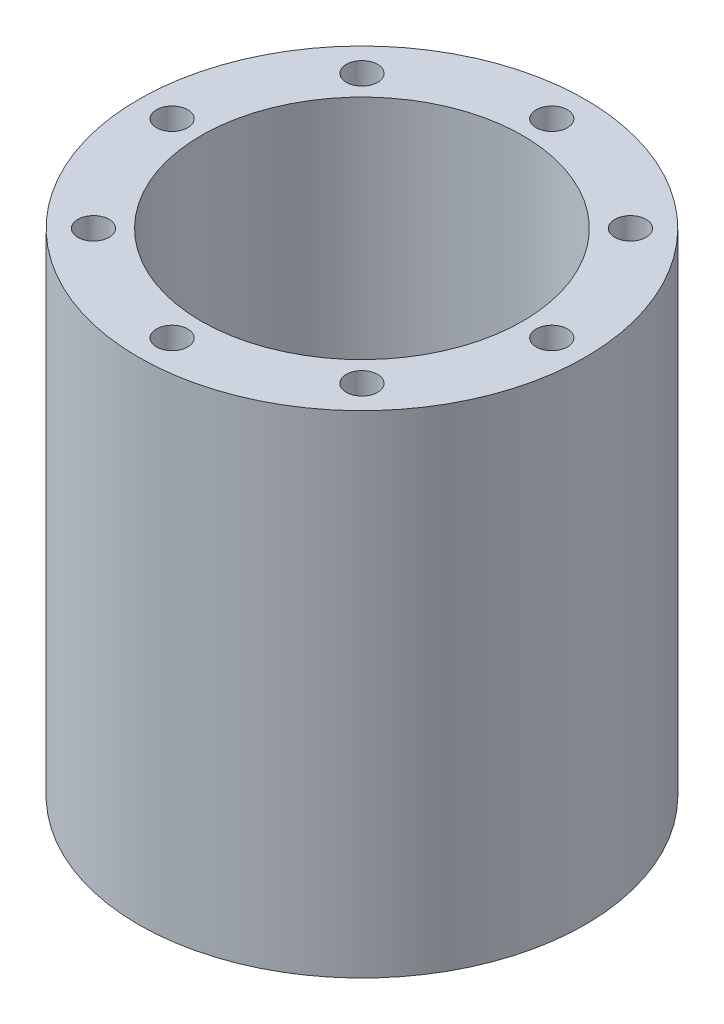
ISO-10303-21;
HEADER;
FILE_DESCRIPTION(('STEP AP214'),'2;1');
FILE_NAME('part.step','',(''),(''),'','','');
FILE_SCHEMA(('AUTOMOTIVE_DESIGN { 1 0 10303 214 1 1 1 1 }'));
ENDSEC;
DATA;
#1=APPLICATION_CONTEXT('core data for automotive mechanical design processes');
#2=APPLICATION_PROTOCOL_DEFINITION('international standard','automotive_design',2000,#1);
#3=PRODUCT_CONTEXT('',#1,'mechanical');
#4=PRODUCT('Part','Part','',(#3));
#5=PRODUCT_RELATED_PRODUCT_CATEGORY('part','',(#4));
#6=PRODUCT_DEFINITION_FORMATION('','',#4);
#7=PRODUCT_DEFINITION_CONTEXT('part definition',#1,'design');
#8=PRODUCT_DEFINITION('design','',#6,#7);
#9=PRODUCT_DEFINITION_SHAPE('','',#8);
#10=(LENGTH_UNIT() NAMED_UNIT(*) SI_UNIT(.MILLI.,.METRE.));
#11=(NAMED_UNIT(*) PLANE_ANGLE_UNIT() SI_UNIT($,.RADIAN.));
#12=(NAMED_UNIT(*) SI_UNIT($,.STERADIAN.) SOLID_ANGLE_UNIT());
#13=UNCERTAINTY_MEASURE_WITH_UNIT(LENGTH_MEASURE(1.E-05),#10,'distance_accuracy_value','');
#14=(GEOMETRIC_REPRESENTATION_CONTEXT(3) GLOBAL_UNCERTAINTY_ASSIGNED_CONTEXT((#13)) GLOBAL_UNIT_ASSIGNED_CONTEXT((#10,
#11,#12)) REPRESENTATION_CONTEXT('',''));
#15=CARTESIAN_POINT('',(0.,0.,0.));
#16=DIRECTION('',(0.,0.,1.));
#17=DIRECTION('',(1.,0.,0.));
#18=AXIS2_PLACEMENT_3D('',#15,#16,#17);
#19=CARTESIAN_POINT('',(-15.0260191002141,27.5,-15.0260191002141));
#20=DIRECTION('',(0.,-1.,0.));
#21=DIRECTION('',(0.,0.,-1.));
#22=AXIS2_PLACEMENT_3D('',#19,#20,#21);
#23=CYLINDRICAL_SURFACE('',#22,1.75);
#24=CARTESIAN_POINT('',(-15.0260191002141,27.5,-15.0260191002141));
#25=DIRECTION('',(0.,1.,0.));
#26=DIRECTION('',(0.,0.,1.));
#27=AXIS2_PLACEMENT_3D('',#24,#25,#26);
#28=CIRCLE('',#27,1.75);
#29=CARTESIAN_POINT('',(-15.0260191002141,27.5,-13.2760191002141));
#30=VERTEX_POINT('',#29);
#31=EDGE_CURVE('E43',#30,#30,#28,.T.);
#32=ORIENTED_EDGE('',*,*,#31,.T.);
#33=EDGE_LOOP('',(#32));
#34=FACE_BOUND('',#33,.T.);
#35=CARTESIAN_POINT('',(-15.0260191002141,-27.5,-15.0260191002141));
#36=DIRECTION('',(0.,1.,0.));
#37=DIRECTION('',(0.,0.,1.));
#38=AXIS2_PLACEMENT_3D('',#35,#36,#37);
#39=CIRCLE('',#38,1.75);
#40=CARTESIAN_POINT('',(-15.0260191002141,-27.5,-13.2760191002141));
#41=VERTEX_POINT('',#40);
#42=EDGE_CURVE('E75',#41,#41,#39,.T.);
#43=ORIENTED_EDGE('',*,*,#42,.F.);
#44=EDGE_LOOP('',(#43));
#45=FACE_BOUND('',#44,.T.);
#46=ADVANCED_FACE('F35',(#34,#45),#23,.F.);
#47=CARTESIAN_POINT('',(-21.25,27.5,0.));
#48=DIRECTION('',(0.,-1.,0.));
#49=DIRECTION('',(0.,0.,-1.));
#50=AXIS2_PLACEMENT_3D('',#47,#48,#49);
#51=CYLINDRICAL_SURFACE('',#50,1.75);
#52=CARTESIAN_POINT('',(-21.25,27.5,0.));
#53=DIRECTION('',(0.,1.,0.));
#54=DIRECTION('',(0.,0.,1.));
#55=AXIS2_PLACEMENT_3D('',#52,#53,#54);
#56=CIRCLE('',#55,1.75);
#57=CARTESIAN_POINT('',(-21.25,27.5,1.75));
#58=VERTEX_POINT('',#57);
#59=EDGE_CURVE('E48',#58,#58,#56,.T.);
#60=ORIENTED_EDGE('',*,*,#59,.T.);
#61=EDGE_LOOP('',(#60));
#62=FACE_BOUND('',#61,.T.);
#63=CARTESIAN_POINT('',(-21.25,-27.5,0.));
#64=DIRECTION('',(0.,1.,0.));
#65=DIRECTION('',(0.,0.,1.));
#66=AXIS2_PLACEMENT_3D('',#63,#64,#65);
#67=CIRCLE('',#66,1.75);
#68=CARTESIAN_POINT('',(-21.25,-27.5,1.75));
#69=VERTEX_POINT('',#68);
#70=EDGE_CURVE('E73',#69,#69,#67,.T.);
#71=ORIENTED_EDGE('',*,*,#70,.F.);
#72=EDGE_LOOP('',(#71));
#73=FACE_BOUND('',#72,.T.);
#74=ADVANCED_FACE('F108',(#62,#73),#51,.F.);
#75=CARTESIAN_POINT('',(-15.0260191002141,27.5,15.0260191002141));
#76=DIRECTION('',(0.,-1.,0.));
#77=DIRECTION('',(0.,0.,-1.));
#78=AXIS2_PLACEMENT_3D('',#75,#76,#77);
#79=CYLINDRICAL_SURFACE('',#78,1.75);
#80=CARTESIAN_POINT('',(-15.0260191002141,27.5,15.0260191002141));
#81=DIRECTION('',(0.,1.,0.));
#82=DIRECTION('',(0.,0.,1.));
#83=AXIS2_PLACEMENT_3D('',#80,#81,#82);
#84=CIRCLE('',#83,1.75);
#85=CARTESIAN_POINT('',(-15.0260191002141,27.5,16.7760191002141));
#86=VERTEX_POINT('',#85);
#87=EDGE_CURVE('E103',#86,#86,#84,.T.);
#88=ORIENTED_EDGE('',*,*,#87,.T.);
#89=EDGE_LOOP('',(#88));
#90=FACE_BOUND('',#89,.T.);
#91=CARTESIAN_POINT('',(-15.0260191002141,-27.5,15.0260191002141));
#92=DIRECTION('',(0.,1.,0.));
#93=DIRECTION('',(0.,0.,1.));
#94=AXIS2_PLACEMENT_3D('',#91,#92,#93);
#95=CIRCLE('',#94,1.75);
#96=CARTESIAN_POINT('',(-15.0260191002141,-27.5,16.7760191002141));
#97=VERTEX_POINT('',#96);
#98=EDGE_CURVE('E70',#97,#97,#95,.T.);
#99=ORIENTED_EDGE('',*,*,#98,.F.);
#100=EDGE_LOOP('',(#99));
#101=FACE_BOUND('',#100,.T.);
#102=ADVANCED_FACE('F126',(#90,#101),#79,.F.);
#103=CARTESIAN_POINT('',(0.,27.5,21.25));
#104=DIRECTION('',(0.,-1.,0.));
#105=DIRECTION('',(0.,0.,-1.));
#106=AXIS2_PLACEMENT_3D('',#103,#104,#105);
#107=CYLINDRICAL_SURFACE('',#106,1.75);
#108=CARTESIAN_POINT('',(0.,27.5,21.25));
#109=DIRECTION('',(0.,1.,0.));
#110=DIRECTION('',(0.,0.,1.));
#111=AXIS2_PLACEMENT_3D('',#108,#109,#110);
#112=CIRCLE('',#111,1.75);
#113=CARTESIAN_POINT('',(0.,27.5,23.));
#114=VERTEX_POINT('',#113);
#115=EDGE_CURVE('E100',#114,#114,#112,.T.);
#116=ORIENTED_EDGE('',*,*,#115,.T.);
#117=EDGE_LOOP('',(#116));
#118=FACE_BOUND('',#117,.T.);
#119=CARTESIAN_POINT('',(0.,-27.5,21.25));
#120=DIRECTION('',(0.,1.,0.));
#121=DIRECTION('',(0.,0.,1.));
#122=AXIS2_PLACEMENT_3D('',#119,#120,#121);
#123=CIRCLE('',#122,1.75);
#124=CARTESIAN_POINT('',(0.,-27.5,23.));
#125=VERTEX_POINT('',#124);
#126=EDGE_CURVE('E67',#125,#125,#123,.T.);
#127=ORIENTED_EDGE('',*,*,#126,.F.);
#128=EDGE_LOOP('',(#127));
#129=FACE_BOUND('',#128,.T.);
#130=ADVANCED_FACE('F133',(#118,#129),#107,.F.);
#131=CARTESIAN_POINT('',(15.0260191002141,27.5,15.0260191002141));
#132=DIRECTION('',(0.,-1.,0.));
#133=DIRECTION('',(0.,0.,-1.));
#134=AXIS2_PLACEMENT_3D('',#131,#132,#133);
#135=CYLINDRICAL_SURFACE('',#134,1.75);
#136=CARTESIAN_POINT('',(15.0260191002141,27.5,15.0260191002141));
#137=DIRECTION('',(0.,1.,0.));
#138=DIRECTION('',(0.,0.,1.));
#139=AXIS2_PLACEMENT_3D('',#136,#137,#138);
#140=CIRCLE('',#139,1.75);
#141=CARTESIAN_POINT('',(15.0260191002141,27.5,16.7760191002141));
#142=VERTEX_POINT('',#141);
#143=EDGE_CURVE('E97',#142,#142,#140,.T.);
#144=ORIENTED_EDGE('',*,*,#143,.T.);
#145=EDGE_LOOP('',(#144));
#146=FACE_BOUND('',#145,.T.);
#147=CARTESIAN_POINT('',(15.0260191002141,-27.5,15.0260191002141));
#148=DIRECTION('',(0.,1.,0.));
#149=DIRECTION('',(0.,0.,1.));
#150=AXIS2_PLACEMENT_3D('',#147,#148,#149);
#151=CIRCLE('',#150,1.75);
#152=CARTESIAN_POINT('',(15.0260191002141,-27.5,16.7760191002141));
#153=VERTEX_POINT('',#152);
#154=EDGE_CURVE('E64',#153,#153,#151,.T.);
#155=ORIENTED_EDGE('',*,*,#154,.F.);
#156=EDGE_LOOP('',(#155));
#157=FACE_BOUND('',#156,.T.);
#158=ADVANCED_FACE('F137',(#146,#157),#135,.F.);
#159=CARTESIAN_POINT('',(21.25,27.5,0.));
#160=DIRECTION('',(0.,-1.,0.));
#161=DIRECTION('',(0.,0.,-1.));
#162=AXIS2_PLACEMENT_3D('',#159,#160,#161);
#163=CYLINDRICAL_SURFACE('',#162,1.75);
#164=CARTESIAN_POINT('',(21.25,27.5,0.));
#165=DIRECTION('',(0.,1.,0.));
#166=DIRECTION('',(0.,0.,1.));
#167=AXIS2_PLACEMENT_3D('',#164,#165,#166);
#168=CIRCLE('',#167,1.75);
#169=CARTESIAN_POINT('',(21.25,27.5,1.75));
#170=VERTEX_POINT('',#169);
#171=EDGE_CURVE('E94',#170,#170,#168,.T.);
#172=ORIENTED_EDGE('',*,*,#171,.T.);
#173=EDGE_LOOP('',(#172));
#174=FACE_BOUND('',#173,.T.);
#175=CARTESIAN_POINT('',(21.25,-27.5,0.));
#176=DIRECTION('',(0.,1.,0.));
#177=DIRECTION('',(0.,0.,1.));
#178=AXIS2_PLACEMENT_3D('',#175,#176,#177);
#179=CIRCLE('',#178,1.75);
#180=CARTESIAN_POINT('',(21.25,-27.5,1.75));
#181=VERTEX_POINT('',#180);
#182=EDGE_CURVE('E61',#181,#181,#179,.T.);
#183=ORIENTED_EDGE('',*,*,#182,.F.);
#184=EDGE_LOOP('',(#183));
#185=FACE_BOUND('',#184,.T.);
#186=ADVANCED_FACE('F141',(#174,#185),#163,.F.);
#187=CARTESIAN_POINT('',(15.0260191002141,27.5,-15.0260191002141));
#188=DIRECTION('',(0.,-1.,0.));
#189=DIRECTION('',(0.,0.,-1.));
#190=AXIS2_PLACEMENT_3D('',#187,#188,#189);
#191=CYLINDRICAL_SURFACE('',#190,1.75);
#192=CARTESIAN_POINT('',(15.0260191002141,27.5,-15.0260191002141));
#193=DIRECTION('',(0.,1.,0.));
#194=DIRECTION('',(0.,0.,1.));
#195=AXIS2_PLACEMENT_3D('',#192,#193,#194);
#196=CIRCLE('',#195,1.75);
#197=CARTESIAN_POINT('',(15.0260191002141,27.5,-13.2760191002141));
#198=VERTEX_POINT('',#197);
#199=EDGE_CURVE('E89',#198,#198,#196,.T.);
#200=ORIENTED_EDGE('',*,*,#199,.T.);
#201=EDGE_LOOP('',(#200));
#202=FACE_BOUND('',#201,.T.);
#203=CARTESIAN_POINT('',(15.0260191002141,-27.5,-15.0260191002141));
#204=DIRECTION('',(0.,1.,0.));
#205=DIRECTION('',(0.,0.,1.));
#206=AXIS2_PLACEMENT_3D('',#203,#204,#205);
#207=CIRCLE('',#206,1.75);
#208=CARTESIAN_POINT('',(15.0260191002141,-27.5,-13.2760191002141));
#209=VERTEX_POINT('',#208);
#210=EDGE_CURVE('E58',#209,#209,#207,.T.);
#211=ORIENTED_EDGE('',*,*,#210,.F.);
#212=EDGE_LOOP('',(#211));
#213=FACE_BOUND('',#212,.T.);
#214=ADVANCED_FACE('F145',(#202,#213),#191,.F.);
#215=CARTESIAN_POINT('',(0.,27.5,-21.25));
#216=DIRECTION('',(0.,-1.,0.));
#217=DIRECTION('',(0.,0.,-1.));
#218=AXIS2_PLACEMENT_3D('',#215,#216,#217);
#219=CYLINDRICAL_SURFACE('',#218,1.75);
#220=CARTESIAN_POINT('',(0.,27.5,-21.25));
#221=DIRECTION('',(0.,1.,0.));
#222=DIRECTION('',(0.,0.,1.));
#223=AXIS2_PLACEMENT_3D('',#220,#221,#222);
#224=CIRCLE('',#223,1.75);
#225=CARTESIAN_POINT('',(0.,27.5,-19.5));
#226=VERTEX_POINT('',#225);
#227=EDGE_CURVE('E84',#226,#226,#224,.T.);
#228=ORIENTED_EDGE('',*,*,#227,.T.);
#229=EDGE_LOOP('',(#228));
#230=FACE_BOUND('',#229,.T.);
#231=CARTESIAN_POINT('',(0.,-27.5,-21.25));
#232=DIRECTION('',(0.,1.,0.));
#233=DIRECTION('',(0.,0.,1.));
#234=AXIS2_PLACEMENT_3D('',#231,#232,#233);
#235=CIRCLE('',#234,1.75);
#236=CARTESIAN_POINT('',(0.,-27.5,-19.5));
#237=VERTEX_POINT('',#236);
#238=EDGE_CURVE('E55',#237,#237,#235,.T.);
#239=ORIENTED_EDGE('',*,*,#238,.F.);
#240=EDGE_LOOP('',(#239));
#241=FACE_BOUND('',#240,.T.);
#242=ADVANCED_FACE('F148',(#230,#241),#219,.F.);
#243=CARTESIAN_POINT('',(0.,27.5,0.));
#244=DIRECTION('',(0.,-1.,0.));
#245=DIRECTION('',(0.,0.,-1.));
#246=AXIS2_PLACEMENT_3D('',#243,#244,#245);
#247=CYLINDRICAL_SURFACE('',#246,18.);
#248=CARTESIAN_POINT('',(0.,27.5,0.));
#249=DIRECTION('',(0.,1.,0.));
#250=DIRECTION('',(0.,0.,1.));
#251=AXIS2_PLACEMENT_3D('',#248,#249,#250);
#252=CIRCLE('',#251,18.);
#253=CARTESIAN_POINT('',(0.,27.5,18.));
#254=VERTEX_POINT('',#253);
#255=EDGE_CURVE('E80',#254,#254,#252,.T.);
#256=ORIENTED_EDGE('',*,*,#255,.T.);
#257=EDGE_LOOP('',(#256));
#258=FACE_BOUND('',#257,.T.);
#259=CARTESIAN_POINT('',(0.,-27.5,0.));
#260=DIRECTION('',(0.,1.,0.));
#261=DIRECTION('',(0.,0.,1.));
#262=AXIS2_PLACEMENT_3D('',#259,#260,#261);
#263=CIRCLE('',#262,18.);
#264=CARTESIAN_POINT('',(0.,-27.5,18.));
#265=VERTEX_POINT('',#264);
#266=EDGE_CURVE('E52',#265,#265,#263,.T.);
#267=ORIENTED_EDGE('',*,*,#266,.F.);
#268=EDGE_LOOP('',(#267));
#269=FACE_BOUND('',#268,.T.);
#270=ADVANCED_FACE('F37',(#258,#269),#247,.F.);
#271=CARTESIAN_POINT('',(0.,27.5,0.));
#272=DIRECTION('',(0.,-1.,0.));
#273=DIRECTION('',(0.,0.,-1.));
#274=AXIS2_PLACEMENT_3D('',#271,#272,#273);
#275=CYLINDRICAL_SURFACE('',#274,25.);
#276=CARTESIAN_POINT('',(0.,27.5,0.));
#277=DIRECTION('',(0.,1.,0.));
#278=DIRECTION('',(0.,0.,1.));
#279=AXIS2_PLACEMENT_3D('',#276,#277,#278);
#280=CIRCLE('',#279,25.);
#281=CARTESIAN_POINT('',(0.,27.5,25.));
#282=VERTEX_POINT('',#281);
#283=EDGE_CURVE('E10',#282,#282,#280,.T.);
#284=ORIENTED_EDGE('',*,*,#283,.F.);
#285=EDGE_LOOP('',(#284));
#286=FACE_BOUND('',#285,.T.);
#287=CARTESIAN_POINT('',(0.,-27.5,0.));
#288=DIRECTION('',(0.,1.,0.));
#289=DIRECTION('',(0.,0.,1.));
#290=AXIS2_PLACEMENT_3D('',#287,#288,#289);
#291=CIRCLE('',#290,25.);
#292=CARTESIAN_POINT('',(0.,-27.5,25.));
#293=VERTEX_POINT('',#292);
#294=EDGE_CURVE('E39',#293,#293,#291,.T.);
#295=ORIENTED_EDGE('',*,*,#294,.T.);
#296=EDGE_LOOP('',(#295));
#297=FACE_BOUND('',#296,.T.);
#298=ADVANCED_FACE('F115',(#286,#297),#275,.T.);
#299=CARTESIAN_POINT('',(0.,27.5,0.));
#300=DIRECTION('',(0.,1.,0.));
#301=DIRECTION('',(0.,0.,1.));
#302=AXIS2_PLACEMENT_3D('',#299,#300,#301);
#303=PLANE('',#302);
#304=ORIENTED_EDGE('',*,*,#255,.F.);
#305=EDGE_LOOP('',(#304));
#306=FACE_BOUND('',#305,.T.);
#307=ORIENTED_EDGE('',*,*,#227,.F.);
#308=EDGE_LOOP('',(#307));
#309=FACE_BOUND('',#308,.T.);
#310=ORIENTED_EDGE('',*,*,#199,.F.);
#311=EDGE_LOOP('',(#310));
#312=FACE_BOUND('',#311,.T.);
#313=ORIENTED_EDGE('',*,*,#171,.F.);
#314=EDGE_LOOP('',(#313));
#315=FACE_BOUND('',#314,.T.);
#316=ORIENTED_EDGE('',*,*,#143,.F.);
#317=EDGE_LOOP('',(#316));
#318=FACE_BOUND('',#317,.T.);
#319=ORIENTED_EDGE('',*,*,#115,.F.);
#320=EDGE_LOOP('',(#319));
#321=FACE_BOUND('',#320,.T.);
#322=ORIENTED_EDGE('',*,*,#87,.F.);
#323=EDGE_LOOP('',(#322));
#324=FACE_BOUND('',#323,.T.);
#325=ORIENTED_EDGE('',*,*,#59,.F.);
#326=EDGE_LOOP('',(#325));
#327=FACE_BOUND('',#326,.T.);
#328=ORIENTED_EDGE('',*,*,#31,.F.);
#329=EDGE_LOOP('',(#328));
#330=FACE_BOUND('',#329,.T.);
#331=ORIENTED_EDGE('',*,*,#283,.T.);
#332=EDGE_LOOP('',(#331));
#333=FACE_BOUND('',#332,.T.);
#334=ADVANCED_FACE('F111',(#306,#309,#312,#315,#318,#321,#324,#327,#330,#333),#303,.T.);
#335=CARTESIAN_POINT('',(0.,-27.5,0.));
#336=DIRECTION('',(0.,1.,0.));
#337=DIRECTION('',(0.,0.,1.));
#338=AXIS2_PLACEMENT_3D('',#335,#336,#337);
#339=PLANE('',#338);
#340=ORIENTED_EDGE('',*,*,#266,.T.);
#341=EDGE_LOOP('',(#340));
#342=FACE_BOUND('',#341,.T.);
#343=ORIENTED_EDGE('',*,*,#238,.T.);
#344=EDGE_LOOP('',(#343));
#345=FACE_BOUND('',#344,.T.);
#346=ORIENTED_EDGE('',*,*,#210,.T.);
#347=EDGE_LOOP('',(#346));
#348=FACE_BOUND('',#347,.T.);
#349=ORIENTED_EDGE('',*,*,#182,.T.);
#350=EDGE_LOOP('',(#349));
#351=FACE_BOUND('',#350,.T.);
#352=ORIENTED_EDGE('',*,*,#154,.T.);
#353=EDGE_LOOP('',(#352));
#354=FACE_BOUND('',#353,.T.);
#355=ORIENTED_EDGE('',*,*,#126,.T.);
#356=EDGE_LOOP('',(#355));
#357=FACE_BOUND('',#356,.T.);
#358=ORIENTED_EDGE('',*,*,#98,.T.);
#359=EDGE_LOOP('',(#358));
#360=FACE_BOUND('',#359,.T.);
#361=ORIENTED_EDGE('',*,*,#70,.T.);
#362=EDGE_LOOP('',(#361));
#363=FACE_BOUND('',#362,.T.);
#364=ORIENTED_EDGE('',*,*,#42,.T.);
#365=EDGE_LOOP('',(#364));
#366=FACE_BOUND('',#365,.T.);
#367=ORIENTED_EDGE('',*,*,#294,.F.);
#368=EDGE_LOOP('',(#367));
#369=FACE_BOUND('',#368,.T.);
#370=ADVANCED_FACE('F114',(#342,#345,#348,#351,#354,#357,#360,#363,#366,#369),#339,.F.);
#371=CLOSED_SHELL('',(#46,#74,#102,#130,#158,#186,#214,#242,#270,#298,#334,#370));
#372=MANIFOLD_SOLID_BREP('B2',#371);
#373=ADVANCED_BREP_SHAPE_REPRESENTATION('',(#18,#372),#14);
#374=SHAPE_DEFINITION_REPRESENTATION(#9,#373);
ENDSEC;
END-ISO-10303-21;
